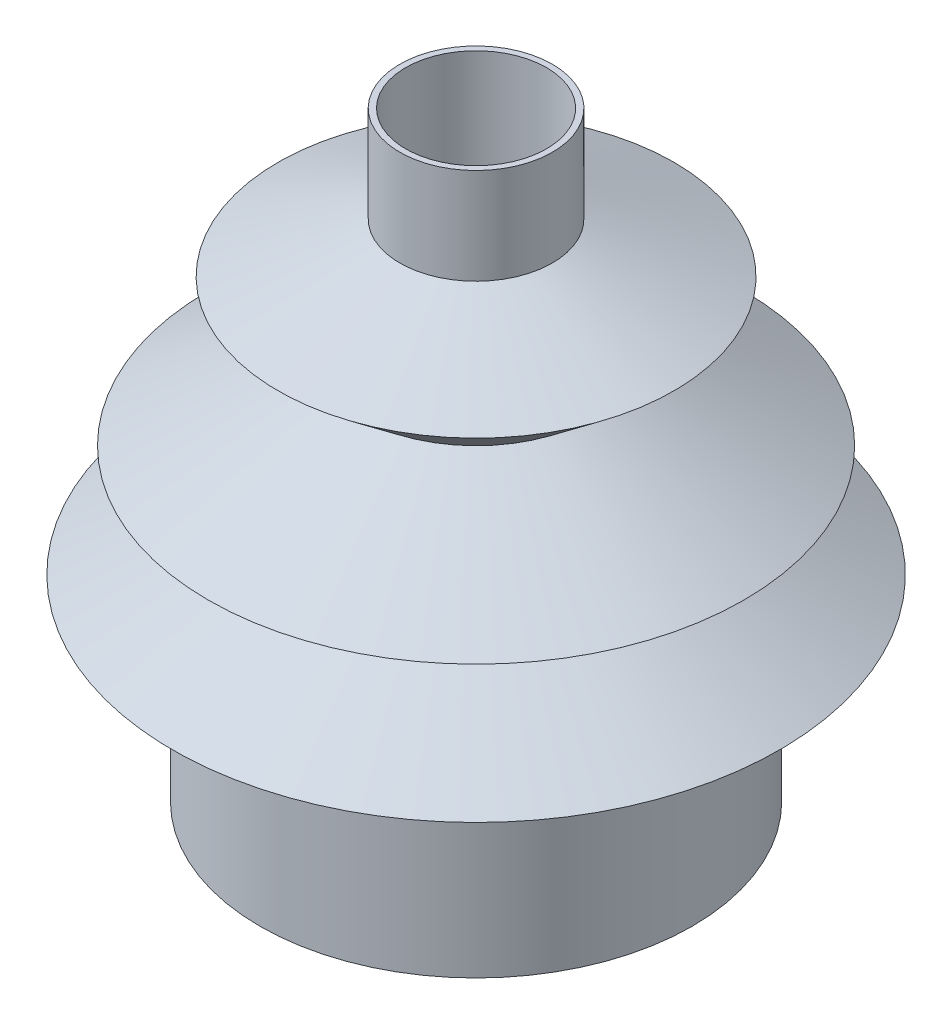
ISO-10303-21;
HEADER;
FILE_DESCRIPTION(('STEP AP214'),'2;1');
FILE_NAME('part.step','',(''),(''),'','','');
FILE_SCHEMA(('AUTOMOTIVE_DESIGN { 1 0 10303 214 1 1 1 1 }'));
ENDSEC;
DATA;
#1=APPLICATION_CONTEXT('core data for automotive mechanical design processes');
#2=APPLICATION_PROTOCOL_DEFINITION('international standard','automotive_design',2000,#1);
#3=PRODUCT_CONTEXT('',#1,'mechanical');
#4=PRODUCT('Part','Part','',(#3));
#5=PRODUCT_RELATED_PRODUCT_CATEGORY('part','',(#4));
#6=PRODUCT_DEFINITION_FORMATION('','',#4);
#7=PRODUCT_DEFINITION_CONTEXT('part definition',#1,'design');
#8=PRODUCT_DEFINITION('design','',#6,#7);
#9=PRODUCT_DEFINITION_SHAPE('','',#8);
#10=(LENGTH_UNIT() NAMED_UNIT(*) SI_UNIT(.MILLI.,.METRE.));
#11=(NAMED_UNIT(*) PLANE_ANGLE_UNIT() SI_UNIT($,.RADIAN.));
#12=(NAMED_UNIT(*) SI_UNIT($,.STERADIAN.) SOLID_ANGLE_UNIT());
#13=UNCERTAINTY_MEASURE_WITH_UNIT(LENGTH_MEASURE(1.E-05),#10,'distance_accuracy_value','');
#14=(GEOMETRIC_REPRESENTATION_CONTEXT(3) GLOBAL_UNCERTAINTY_ASSIGNED_CONTEXT((#13)) GLOBAL_UNIT_ASSIGNED_CONTEXT((#10,
#11,#12)) REPRESENTATION_CONTEXT('',''));
#15=CARTESIAN_POINT('',(0.,0.,0.));
#16=DIRECTION('',(0.,0.,1.));
#17=DIRECTION('',(1.,0.,0.));
#18=AXIS2_PLACEMENT_3D('',#15,#16,#17);
#19=CARTESIAN_POINT('',(-9.2075,0.,0.));
#20=DIRECTION('',(0.,1.,0.));
#21=DIRECTION('',(0.,0.,1.));
#22=AXIS2_PLACEMENT_3D('',#19,#20,#21);
#23=PLANE('',#22);
#24=CARTESIAN_POINT('',(0.,0.,0.));
#25=DIRECTION('',(0.,-1.,0.));
#26=DIRECTION('',(0.,0.,-1.));
#27=AXIS2_PLACEMENT_3D('',#24,#25,#26);
#28=CIRCLE('',#27,6.90589318742276);
#29=CARTESIAN_POINT('',(0.,0.,-6.90589318742276));
#30=VERTEX_POINT('',#29);
#31=EDGE_CURVE('E41',#30,#30,#28,.T.);
#32=ORIENTED_EDGE('',*,*,#31,.F.);
#33=EDGE_LOOP('',(#32));
#34=FACE_BOUND('',#33,.T.);
#35=CARTESIAN_POINT('',(0.,0.,0.));
#36=DIRECTION('',(0.,-1.,0.));
#37=DIRECTION('',(0.,0.,-1.));
#38=AXIS2_PLACEMENT_3D('',#35,#36,#37);
#39=CIRCLE('',#38,9.2075);
#40=CARTESIAN_POINT('',(0.,0.,-9.2075));
#41=VERTEX_POINT('',#40);
#42=EDGE_CURVE('E10',#41,#41,#39,.T.);
#43=ORIENTED_EDGE('',*,*,#42,.T.);
#44=EDGE_LOOP('',(#43));
#45=FACE_BOUND('',#44,.T.);
#46=ADVANCED_FACE('F34',(#34,#45),#23,.F.);
#47=CARTESIAN_POINT('',(0.,-7.05935236143333,0.));
#48=DIRECTION('',(0.,-1.,0.));
#49=DIRECTION('',(0.,0.,-1.));
#50=AXIS2_PLACEMENT_3D('',#47,#48,#49);
#51=CYLINDRICAL_SURFACE('',#50,6.90589318742276);
#52=CARTESIAN_POINT('',(0.,7.39066079762414,0.));
#53=DIRECTION('',(0.,-1.,0.));
#54=DIRECTION('',(0.,0.,-1.));
#55=AXIS2_PLACEMENT_3D('',#52,#53,#54);
#56=CIRCLE('',#55,6.90589318742276);
#57=CARTESIAN_POINT('',(0.,7.39066079762414,-6.90589318742276));
#58=VERTEX_POINT('',#57);
#59=EDGE_CURVE('E45',#58,#58,#56,.T.);
#60=ORIENTED_EDGE('',*,*,#59,.F.);
#61=EDGE_LOOP('',(#60));
#62=FACE_BOUND('',#61,.T.);
#63=ORIENTED_EDGE('',*,*,#31,.T.);
#64=EDGE_LOOP('',(#63));
#65=FACE_BOUND('',#64,.T.);
#66=ADVANCED_FACE('F121',(#62,#65),#51,.F.);
#67=CARTESIAN_POINT('',(0.,7.39066079762414,0.));
#68=DIRECTION('',(0.,1.,0.));
#69=DIRECTION('',(0.,0.,1.));
#70=AXIS2_PLACEMENT_3D('',#67,#68,#69);
#71=CONICAL_SURFACE('',#70,6.90589318742276,1.20388909202799);
#72=CARTESIAN_POINT('',(0.,8.68939093814392,0.));
#73=DIRECTION('',(0.,-1.,0.));
#74=DIRECTION('',(0.,0.,-1.));
#75=AXIS2_PLACEMENT_3D('',#72,#73,#74);
#76=CIRCLE('',#75,10.2852802406555);
#77=CARTESIAN_POINT('',(0.,8.68939093814392,-10.2852802406555));
#78=VERTEX_POINT('',#77);
#79=EDGE_CURVE('E50',#78,#78,#76,.T.);
#80=ORIENTED_EDGE('',*,*,#79,.F.);
#81=EDGE_LOOP('',(#80));
#82=FACE_BOUND('',#81,.T.);
#83=ORIENTED_EDGE('',*,*,#59,.T.);
#84=EDGE_LOOP('',(#83));
#85=FACE_BOUND('',#84,.T.);
#86=ADVANCED_FACE('F126',(#82,#85),#71,.F.);
#87=CARTESIAN_POINT('',(0.,8.68939093814392,0.));
#88=DIRECTION('',(0.,-1.,0.));
#89=DIRECTION('',(0.,0.,-1.));
#90=AXIS2_PLACEMENT_3D('',#87,#88,#89);
#91=CONICAL_SURFACE('',#90,10.2852802406555,1.10734591690211);
#92=CARTESIAN_POINT('',(0.,11.2008584236349,0.));
#93=DIRECTION('',(0.,-1.,0.));
#94=DIRECTION('',(0.,0.,-1.));
#95=AXIS2_PLACEMENT_3D('',#92,#93,#94);
#96=CIRCLE('',#95,5.25986799686962);
#97=CARTESIAN_POINT('',(0.,11.2008584236349,-5.25986799686962));
#98=VERTEX_POINT('',#97);
#99=EDGE_CURVE('E53',#98,#98,#96,.T.);
#100=ORIENTED_EDGE('',*,*,#99,.F.);
#101=EDGE_LOOP('',(#100));
#102=FACE_BOUND('',#101,.T.);
#103=ORIENTED_EDGE('',*,*,#79,.T.);
#104=EDGE_LOOP('',(#103));
#105=FACE_BOUND('',#104,.T.);
#106=ADVANCED_FACE('F133',(#102,#105),#91,.F.);
#107=CARTESIAN_POINT('',(0.,11.2008584236349,0.));
#108=DIRECTION('',(0.,1.,0.));
#109=DIRECTION('',(0.,0.,1.));
#110=AXIS2_PLACEMENT_3D('',#107,#108,#109);
#111=CONICAL_SURFACE('',#110,5.25986799686962,1.20388909202799);
#112=CARTESIAN_POINT('',(0.,12.6309121367084,0.));
#113=DIRECTION('',(0.,-1.,0.));
#114=DIRECTION('',(0.,0.,-1.));
#115=AXIS2_PLACEMENT_3D('',#112,#113,#114);
#116=CIRCLE('',#115,8.98096821053954);
#117=CARTESIAN_POINT('',(0.,12.6309121367084,-8.98096821053954));
#118=VERTEX_POINT('',#117);
#119=EDGE_CURVE('E56',#118,#118,#116,.T.);
#120=ORIENTED_EDGE('',*,*,#119,.F.);
#121=EDGE_LOOP('',(#120));
#122=FACE_BOUND('',#121,.T.);
#123=ORIENTED_EDGE('',*,*,#99,.T.);
#124=EDGE_LOOP('',(#123));
#125=FACE_BOUND('',#124,.T.);
#126=ADVANCED_FACE('F140',(#122,#125),#111,.F.);
#127=CARTESIAN_POINT('',(0.,12.6309121367084,0.));
#128=DIRECTION('',(0.,-1.,0.));
#129=DIRECTION('',(0.,0.,-1.));
#130=AXIS2_PLACEMENT_3D('',#127,#128,#129);
#131=CONICAL_SURFACE('',#130,8.98096821053954,1.0427122480889);
#132=CARTESIAN_POINT('',(0.,16.1198874578075,0.));
#133=DIRECTION('',(0.,-1.,0.));
#134=DIRECTION('',(0.,0.,-1.));
#135=AXIS2_PLACEMENT_3D('',#132,#133,#134);
#136=CIRCLE('',#135,3.);
#137=CARTESIAN_POINT('',(0.,16.1198874578075,-3.));
#138=VERTEX_POINT('',#137);
#139=EDGE_CURVE('E86',#138,#138,#136,.F.);
#140=ORIENTED_EDGE('',*,*,#139,.T.);
#141=EDGE_LOOP('',(#140));
#142=FACE_BOUND('',#141,.T.);
#143=ORIENTED_EDGE('',*,*,#119,.T.);
#144=EDGE_LOOP('',(#143));
#145=FACE_BOUND('',#144,.T.);
#146=ADVANCED_FACE('F144',(#142,#145),#131,.F.);
#147=CARTESIAN_POINT('',(0.,25.5780131525967,0.));
#148=DIRECTION('',(0.,-1.,0.));
#149=DIRECTION('',(0.,0.,-1.));
#150=AXIS2_PLACEMENT_3D('',#147,#148,#149);
#151=PLANE('',#150);
#152=CARTESIAN_POINT('',(0.,25.5780131525967,0.));
#153=DIRECTION('',(0.,-1.,0.));
#154=DIRECTION('',(0.,0.,-1.));
#155=AXIS2_PLACEMENT_3D('',#152,#153,#154);
#156=CIRCLE('',#155,3.);
#157=CARTESIAN_POINT('',(0.,25.5780131525967,-3.));
#158=VERTEX_POINT('',#157);
#159=EDGE_CURVE('E37',#158,#158,#156,.T.);
#160=ORIENTED_EDGE('',*,*,#159,.T.);
#161=EDGE_LOOP('',(#160));
#162=FACE_BOUND('',#161,.T.);
#163=CARTESIAN_POINT('',(0.,25.5780131525967,0.));
#164=DIRECTION('',(0.,-1.,0.));
#165=DIRECTION('',(0.,0.,-1.));
#166=AXIS2_PLACEMENT_3D('',#163,#164,#165);
#167=CIRCLE('',#166,3.25);
#168=CARTESIAN_POINT('',(0.,25.5780131525967,-3.25));
#169=VERTEX_POINT('',#168);
#170=EDGE_CURVE('E62',#169,#169,#167,.T.);
#171=ORIENTED_EDGE('',*,*,#170,.F.);
#172=EDGE_LOOP('',(#171));
#173=FACE_BOUND('',#172,.T.);
#174=ADVANCED_FACE('F99',(#162,#173),#151,.F.);
#175=CARTESIAN_POINT('',(0.,-7.05935236143333,0.));
#176=DIRECTION('',(0.,-1.,0.));
#177=DIRECTION('',(0.,0.,-1.));
#178=AXIS2_PLACEMENT_3D('',#175,#176,#177);
#179=CYLINDRICAL_SURFACE('',#178,3.25);
#180=CARTESIAN_POINT('',(0.,21.491279950771,0.));
#181=DIRECTION('',(0.,-1.,0.));
#182=DIRECTION('',(0.,0.,-1.));
#183=AXIS2_PLACEMENT_3D('',#180,#181,#182);
#184=CIRCLE('',#183,3.25);
#185=CARTESIAN_POINT('',(0.,21.491279950771,-3.25));
#186=VERTEX_POINT('',#185);
#187=EDGE_CURVE('E65',#186,#186,#184,.T.);
#188=ORIENTED_EDGE('',*,*,#187,.F.);
#189=EDGE_LOOP('',(#188));
#190=FACE_BOUND('',#189,.T.);
#191=ORIENTED_EDGE('',*,*,#170,.T.);
#192=EDGE_LOOP('',(#191));
#193=FACE_BOUND('',#192,.T.);
#194=ADVANCED_FACE('F154',(#190,#193),#179,.T.);
#195=CARTESIAN_POINT('',(0.,21.491279950771,0.));
#196=DIRECTION('',(0.,-1.,0.));
#197=DIRECTION('',(0.,0.,-1.));
#198=AXIS2_PLACEMENT_3D('',#195,#196,#197);
#199=CONICAL_SURFACE('',#198,3.25,1.18207669629529);
#200=CARTESIAN_POINT('',(0.,19.3680864577588,0.));
#201=DIRECTION('',(0.,-1.,0.));
#202=DIRECTION('',(0.,0.,-1.));
#203=AXIS2_PLACEMENT_3D('',#200,#201,#202);
#204=CIRCLE('',#203,8.43409686777168);
#205=CARTESIAN_POINT('',(0.,19.3680864577588,-8.43409686777168));
#206=VERTEX_POINT('',#205);
#207=EDGE_CURVE('E68',#206,#206,#204,.T.);
#208=ORIENTED_EDGE('',*,*,#207,.F.);
#209=EDGE_LOOP('',(#208));
#210=FACE_BOUND('',#209,.T.);
#211=ORIENTED_EDGE('',*,*,#187,.T.);
#212=EDGE_LOOP('',(#211));
#213=FACE_BOUND('',#212,.T.);
#214=ADVANCED_FACE('F157',(#210,#213),#199,.T.);
#215=CARTESIAN_POINT('',(0.,19.3680864577588,0.));
#216=DIRECTION('',(0.,1.,0.));
#217=DIRECTION('',(0.,0.,1.));
#218=AXIS2_PLACEMENT_3D('',#215,#216,#217);
#219=CONICAL_SURFACE('',#218,8.43409686777168,0.902218097583944);
#220=CARTESIAN_POINT('',(0.,16.7086088080839,0.));
#221=DIRECTION('',(0.,-1.,0.));
#222=DIRECTION('',(0.,0.,-1.));
#223=AXIS2_PLACEMENT_3D('',#220,#221,#222);
#224=CIRCLE('',#223,5.06742488075909);
#225=CARTESIAN_POINT('',(0.,16.7086088080839,-5.06742488075909));
#226=VERTEX_POINT('',#225);
#227=EDGE_CURVE('E71',#226,#226,#224,.T.);
#228=ORIENTED_EDGE('',*,*,#227,.F.);
#229=EDGE_LOOP('',(#228));
#230=FACE_BOUND('',#229,.T.);
#231=ORIENTED_EDGE('',*,*,#207,.T.);
#232=EDGE_LOOP('',(#231));
#233=FACE_BOUND('',#232,.T.);
#234=ADVANCED_FACE('F161',(#230,#233),#219,.T.);
#235=CARTESIAN_POINT('',(0.,16.7086088080839,0.));
#236=DIRECTION('',(0.,-1.,0.));
#237=DIRECTION('',(0.,0.,-1.));
#238=AXIS2_PLACEMENT_3D('',#235,#236,#237);
#239=CONICAL_SURFACE('',#238,5.06742488075909,1.05685918988105);
#240=CARTESIAN_POINT('',(0.,13.131062925356,0.));
#241=DIRECTION('',(0.,-1.,0.));
#242=DIRECTION('',(0.,0.,-1.));
#243=AXIS2_PLACEMENT_3D('',#240,#241,#242);
#244=CIRCLE('',#243,11.4045334681988);
#245=CARTESIAN_POINT('',(0.,13.131062925356,-11.4045334681988));
#246=VERTEX_POINT('',#245);
#247=EDGE_CURVE('E74',#246,#246,#244,.T.);
#248=ORIENTED_EDGE('',*,*,#247,.F.);
#249=EDGE_LOOP('',(#248));
#250=FACE_BOUND('',#249,.T.);
#251=ORIENTED_EDGE('',*,*,#227,.T.);
#252=EDGE_LOOP('',(#251));
#253=FACE_BOUND('',#252,.T.);
#254=ADVANCED_FACE('F165',(#250,#253),#239,.T.);
#255=CARTESIAN_POINT('',(0.,13.131062925356,0.));
#256=DIRECTION('',(0.,1.,0.));
#257=DIRECTION('',(0.,0.,1.));
#258=AXIS2_PLACEMENT_3D('',#255,#256,#257);
#259=CONICAL_SURFACE('',#258,11.4045334681988,1.20388909202799);
#260=CARTESIAN_POINT('',(0.,11.5517937910109,0.));
#261=DIRECTION('',(0.,-1.,0.));
#262=DIRECTION('',(0.,0.,-1.));
#263=AXIS2_PLACEMENT_3D('',#260,#261,#262);
#264=CIRCLE('',#263,7.29516424693773);
#265=CARTESIAN_POINT('',(0.,11.5517937910109,-7.29516424693773));
#266=VERTEX_POINT('',#265);
#267=EDGE_CURVE('E77',#266,#266,#264,.T.);
#268=ORIENTED_EDGE('',*,*,#267,.F.);
#269=EDGE_LOOP('',(#268));
#270=FACE_BOUND('',#269,.T.);
#271=ORIENTED_EDGE('',*,*,#247,.T.);
#272=EDGE_LOOP('',(#271));
#273=FACE_BOUND('',#272,.T.);
#274=ADVANCED_FACE('F169',(#270,#273),#259,.T.);
#275=CARTESIAN_POINT('',(0.,11.5517937910109,0.));
#276=DIRECTION('',(0.,-1.,0.));
#277=DIRECTION('',(0.,0.,-1.));
#278=AXIS2_PLACEMENT_3D('',#275,#276,#277);
#279=CONICAL_SURFACE('',#278,7.29516424693773,1.05685918988105);
#280=CARTESIAN_POINT('',(0.,8.37003821375458,0.));
#281=DIRECTION('',(0.,-1.,0.));
#282=DIRECTION('',(0.,0.,-1.));
#283=AXIS2_PLACEMENT_3D('',#280,#281,#282);
#284=CIRCLE('',#283,12.9311871667586);
#285=CARTESIAN_POINT('',(0.,8.37003821375458,-12.9311871667586));
#286=VERTEX_POINT('',#285);
#287=EDGE_CURVE('E80',#286,#286,#284,.T.);
#288=ORIENTED_EDGE('',*,*,#287,.F.);
#289=EDGE_LOOP('',(#288));
#290=FACE_BOUND('',#289,.T.);
#291=ORIENTED_EDGE('',*,*,#267,.T.);
#292=EDGE_LOOP('',(#291));
#293=FACE_BOUND('',#292,.T.);
#294=ADVANCED_FACE('F173',(#290,#293),#279,.T.);
#295=CARTESIAN_POINT('',(0.,8.37003821375458,0.));
#296=DIRECTION('',(0.,1.,0.));
#297=DIRECTION('',(0.,0.,1.));
#298=AXIS2_PLACEMENT_3D('',#295,#296,#297);
#299=CONICAL_SURFACE('',#298,12.9311871667586,1.20388909202799);
#300=CARTESIAN_POINT('',(0.,6.93899031034562,0.));
#301=DIRECTION('',(0.,-1.,0.));
#302=DIRECTION('',(0.,0.,-1.));
#303=AXIS2_PLACEMENT_3D('',#300,#301,#302);
#304=CIRCLE('',#303,9.2075);
#305=CARTESIAN_POINT('',(0.,6.93899031034562,-9.2075));
#306=VERTEX_POINT('',#305);
#307=EDGE_CURVE('E83',#306,#306,#304,.T.);
#308=ORIENTED_EDGE('',*,*,#307,.F.);
#309=EDGE_LOOP('',(#308));
#310=FACE_BOUND('',#309,.T.);
#311=ORIENTED_EDGE('',*,*,#287,.T.);
#312=EDGE_LOOP('',(#311));
#313=FACE_BOUND('',#312,.T.);
#314=ADVANCED_FACE('F115',(#310,#313),#299,.T.);
#315=CARTESIAN_POINT('',(0.,-7.05935236143333,0.));
#316=DIRECTION('',(0.,-1.,0.));
#317=DIRECTION('',(0.,0.,-1.));
#318=AXIS2_PLACEMENT_3D('',#315,#316,#317);
#319=CYLINDRICAL_SURFACE('',#318,9.2075);
#320=ORIENTED_EDGE('',*,*,#42,.F.);
#321=EDGE_LOOP('',(#320));
#322=FACE_BOUND('',#321,.T.);
#323=ORIENTED_EDGE('',*,*,#307,.T.);
#324=EDGE_LOOP('',(#323));
#325=FACE_BOUND('',#324,.T.);
#326=ADVANCED_FACE('F106',(#322,#325),#319,.T.);
#327=CARTESIAN_POINT('',(0.,0.,0.));
#328=DIRECTION('',(0.,1.,0.));
#329=DIRECTION('',(0.,0.,1.));
#330=AXIS2_PLACEMENT_3D('',#327,#328,#329);
#331=CYLINDRICAL_SURFACE('',#330,3.);
#332=ORIENTED_EDGE('',*,*,#159,.F.);
#333=EDGE_LOOP('',(#332));
#334=FACE_BOUND('',#333,.T.);
#335=CARTESIAN_POINT('',(0.,20.2858539639654,0.));
#336=DIRECTION('',(0.,-1.,0.));
#337=DIRECTION('',(0.,0.,-1.));
#338=AXIS2_PLACEMENT_3D('',#335,#336,#337);
#339=CIRCLE('',#338,3.);
#340=CARTESIAN_POINT('',(0.,20.2858539639654,-3.));
#341=VERTEX_POINT('',#340);
#342=EDGE_CURVE('E92',#341,#341,#339,.F.);
#343=ORIENTED_EDGE('',*,*,#342,.F.);
#344=EDGE_LOOP('',(#343));
#345=FACE_BOUND('',#344,.T.);
#346=ADVANCED_FACE('F102',(#334,#345),#331,.F.);
#347=CARTESIAN_POINT('',(0.,19.4746334758796,0.));
#348=DIRECTION('',(0.,-1.,0.));
#349=DIRECTION('',(0.,0.,-1.));
#350=AXIS2_PLACEMENT_3D('',#347,#348,#349);
#351=CONICAL_SURFACE('',#350,4.43696055616641,1.05685918988105);
#352=ORIENTED_EDGE('',*,*,#342,.T.);
#353=EDGE_LOOP('',(#352));
#354=FACE_BOUND('',#353,.T.);
#355=CARTESIAN_POINT('',(0.,19.4746334758796,0.));
#356=DIRECTION('',(0.,-1.,0.));
#357=DIRECTION('',(0.,0.,-1.));
#358=AXIS2_PLACEMENT_3D('',#355,#356,#357);
#359=CIRCLE('',#358,4.43696055616641);
#360=CARTESIAN_POINT('',(0.,19.4746334758796,-4.43696055616641));
#361=VERTEX_POINT('',#360);
#362=EDGE_CURVE('E59',#361,#361,#359,.T.);
#363=ORIENTED_EDGE('',*,*,#362,.T.);
#364=EDGE_LOOP('',(#363));
#365=FACE_BOUND('',#364,.T.);
#366=ADVANCED_FACE('F105',(#354,#365),#351,.F.);
#367=CARTESIAN_POINT('',(0.,18.9162440057,0.));
#368=DIRECTION('',(0.,1.,0.));
#369=DIRECTION('',(0.,0.,1.));
#370=AXIS2_PLACEMENT_3D('',#367,#368,#369);
#371=CONICAL_SURFACE('',#370,2.98399193142116,1.20388909202799);
#372=CARTESIAN_POINT('',(0.,18.9223960565978,0.));
#373=DIRECTION('',(0.,1.,0.));
#374=DIRECTION('',(0.,0.,1.));
#375=AXIS2_PLACEMENT_3D('',#372,#373,#374);
#376=CIRCLE('',#375,3.);
#377=CARTESIAN_POINT('',(0.,18.9223960565978,3.));
#378=VERTEX_POINT('',#377);
#379=EDGE_CURVE('E89',#378,#378,#376,.F.);
#380=ORIENTED_EDGE('',*,*,#379,.T.);
#381=EDGE_LOOP('',(#380));
#382=FACE_BOUND('',#381,.T.);
#383=ORIENTED_EDGE('',*,*,#362,.F.);
#384=EDGE_LOOP('',(#383));
#385=FACE_BOUND('',#384,.T.);
#386=ADVANCED_FACE('F113',(#382,#385),#371,.F.);
#387=ORIENTED_EDGE('',*,*,#379,.F.);
#388=EDGE_LOOP('',(#387));
#389=FACE_BOUND('',#388,.T.);
#390=ORIENTED_EDGE('',*,*,#139,.F.);
#391=EDGE_LOOP('',(#390));
#392=FACE_BOUND('',#391,.T.);
#393=ADVANCED_FACE('F108',(#389,#392),#331,.F.);
#394=CLOSED_SHELL('',(#46,#66,#86,#106,#126,#146,#174,#194,#214,#234,#254,#274,#294,#314,#326,
#346,#366,#386,#393));
#395=MANIFOLD_SOLID_BREP('B2',#394);
#396=ADVANCED_BREP_SHAPE_REPRESENTATION('',(#18,#395),#14);
#397=SHAPE_DEFINITION_REPRESENTATION(#9,#396);
ENDSEC;
END-ISO-10303-21;
